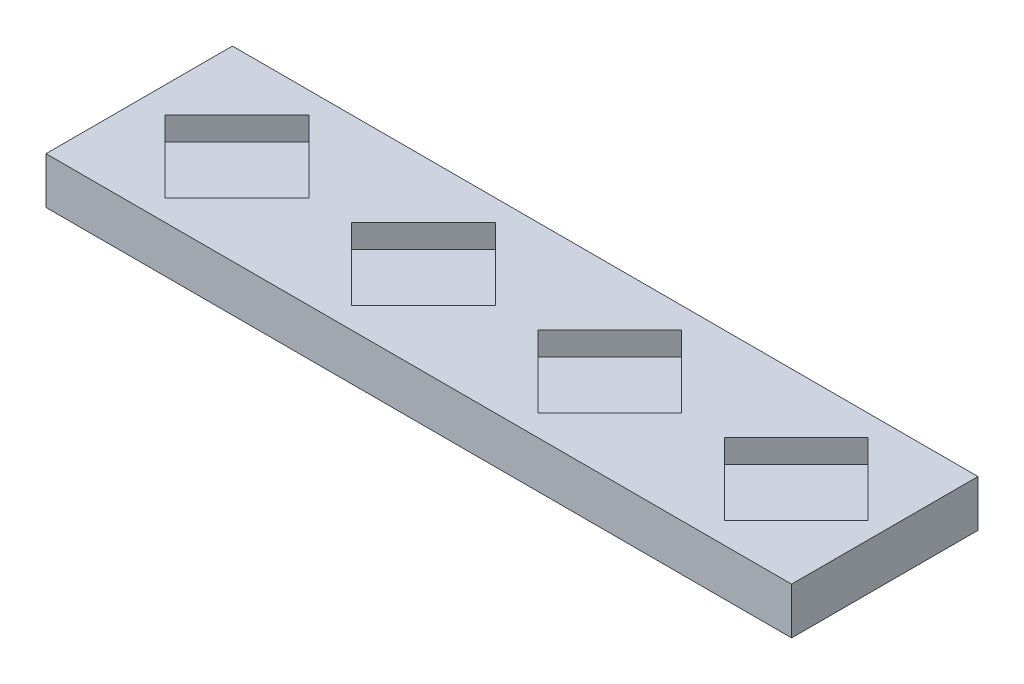
ISO-10303-21;
HEADER;
FILE_DESCRIPTION(('STEP AP214'),'2;1');
FILE_NAME('part.step','',(''),(''),'','','');
FILE_SCHEMA(('AUTOMOTIVE_DESIGN { 1 0 10303 214 1 1 1 1 }'));
ENDSEC;
DATA;
#1=APPLICATION_CONTEXT('core data for automotive mechanical design processes');
#2=APPLICATION_PROTOCOL_DEFINITION('international standard','automotive_design',2000,#1);
#3=PRODUCT_CONTEXT('',#1,'mechanical');
#4=PRODUCT('Part','Part','',(#3));
#5=PRODUCT_RELATED_PRODUCT_CATEGORY('part','',(#4));
#6=PRODUCT_DEFINITION_FORMATION('','',#4);
#7=PRODUCT_DEFINITION_CONTEXT('part definition',#1,'design');
#8=PRODUCT_DEFINITION('design','',#6,#7);
#9=PRODUCT_DEFINITION_SHAPE('','',#8);
#10=(LENGTH_UNIT() NAMED_UNIT(*) SI_UNIT(.MILLI.,.METRE.));
#11=(NAMED_UNIT(*) PLANE_ANGLE_UNIT() SI_UNIT($,.RADIAN.));
#12=(NAMED_UNIT(*) SI_UNIT($,.STERADIAN.) SOLID_ANGLE_UNIT());
#13=UNCERTAINTY_MEASURE_WITH_UNIT(LENGTH_MEASURE(1.E-05),#10,'distance_accuracy_value','');
#14=(GEOMETRIC_REPRESENTATION_CONTEXT(3) GLOBAL_UNCERTAINTY_ASSIGNED_CONTEXT((#13)) GLOBAL_UNIT_ASSIGNED_CONTEXT((#10,
#11,#12)) REPRESENTATION_CONTEXT('',''));
#15=CARTESIAN_POINT('',(0.,0.,0.));
#16=DIRECTION('',(0.,0.,1.));
#17=DIRECTION('',(1.,0.,0.));
#18=AXIS2_PLACEMENT_3D('',#15,#16,#17);
#19=CARTESIAN_POINT('',(0.,12.7,0.));
#20=DIRECTION('',(0.,0.,-1.));
#21=DIRECTION('',(-1.,0.,0.));
#22=AXIS2_PLACEMENT_3D('',#19,#20,#21);
#23=PLANE('',#22);
#24=DIRECTION('',(1.,0.,0.));
#25=VECTOR('',#24,1.);
#26=CARTESIAN_POINT('',(0.,0.,0.));
#27=LINE('',#26,#25);
#28=CARTESIAN_POINT('',(-203.2,0.,0.));
#29=VERTEX_POINT('',#28);
#30=CARTESIAN_POINT('',(0.,0.,0.));
#31=VERTEX_POINT('',#30);
#32=EDGE_CURVE('E224',#29,#31,#27,.T.);
#33=ORIENTED_EDGE('',*,*,#32,.T.);
#34=DIRECTION('',(0.,-1.,0.));
#35=VECTOR('',#34,1.);
#36=CARTESIAN_POINT('',(0.,12.7,0.));
#37=LINE('',#36,#35);
#38=CARTESIAN_POINT('',(0.,12.7,0.));
#39=VERTEX_POINT('',#38);
#40=EDGE_CURVE('E11',#39,#31,#37,.T.);
#41=ORIENTED_EDGE('',*,*,#40,.F.);
#42=DIRECTION('',(1.,0.,0.));
#43=VECTOR('',#42,1.);
#44=CARTESIAN_POINT('',(0.,12.7,0.));
#45=LINE('',#44,#43);
#46=CARTESIAN_POINT('',(-203.2,12.7,0.));
#47=VERTEX_POINT('',#46);
#48=EDGE_CURVE('E359',#47,#39,#45,.T.);
#49=ORIENTED_EDGE('',*,*,#48,.F.);
#50=DIRECTION('',(0.,-1.,0.));
#51=VECTOR('',#50,1.);
#52=CARTESIAN_POINT('',(-203.2,12.7,0.));
#53=LINE('',#52,#51);
#54=EDGE_CURVE('E373',#47,#29,#53,.T.);
#55=ORIENTED_EDGE('',*,*,#54,.T.);
#56=EDGE_LOOP('',(#33,#41,#49,#55));
#57=FACE_BOUND('',#56,.T.);
#58=ADVANCED_FACE('F41',(#57),#23,.F.);
#59=CARTESIAN_POINT('',(0.,12.7,-50.8));
#60=DIRECTION('',(-1.,0.,0.));
#61=DIRECTION('',(0.,0.,1.));
#62=AXIS2_PLACEMENT_3D('',#59,#60,#61);
#63=PLANE('',#62);
#64=DIRECTION('',(0.,0.,-1.));
#65=VECTOR('',#64,1.);
#66=CARTESIAN_POINT('',(0.,0.,-50.8));
#67=LINE('',#66,#65);
#68=CARTESIAN_POINT('',(0.,0.,-50.8));
#69=VERTEX_POINT('',#68);
#70=EDGE_CURVE('E377',#31,#69,#67,.T.);
#71=ORIENTED_EDGE('',*,*,#70,.T.);
#72=DIRECTION('',(0.,-1.,0.));
#73=VECTOR('',#72,1.);
#74=CARTESIAN_POINT('',(0.,12.7,-50.8));
#75=LINE('',#74,#73);
#76=CARTESIAN_POINT('',(0.,12.7,-50.8));
#77=VERTEX_POINT('',#76);
#78=EDGE_CURVE('E49',#77,#69,#75,.T.);
#79=ORIENTED_EDGE('',*,*,#78,.F.);
#80=DIRECTION('',(0.,0.,-1.));
#81=VECTOR('',#80,1.);
#82=CARTESIAN_POINT('',(0.,12.7,-50.8));
#83=LINE('',#82,#81);
#84=EDGE_CURVE('E363',#39,#77,#83,.T.);
#85=ORIENTED_EDGE('',*,*,#84,.F.);
#86=ORIENTED_EDGE('',*,*,#40,.T.);
#87=EDGE_LOOP('',(#71,#79,#85,#86));
#88=FACE_BOUND('',#87,.T.);
#89=ADVANCED_FACE('F413',(#88),#63,.F.);
#90=CARTESIAN_POINT('',(-203.2,12.7,-50.8));
#91=DIRECTION('',(0.,0.,1.));
#92=DIRECTION('',(1.,0.,0.));
#93=AXIS2_PLACEMENT_3D('',#90,#91,#92);
#94=PLANE('',#93);
#95=DIRECTION('',(-1.,0.,0.));
#96=VECTOR('',#95,1.);
#97=CARTESIAN_POINT('',(-203.2,0.,-50.8));
#98=LINE('',#97,#96);
#99=CARTESIAN_POINT('',(-203.2,0.,-50.8));
#100=VERTEX_POINT('',#99);
#101=EDGE_CURVE('E380',#69,#100,#98,.T.);
#102=ORIENTED_EDGE('',*,*,#101,.T.);
#103=DIRECTION('',(0.,-1.,0.));
#104=VECTOR('',#103,1.);
#105=CARTESIAN_POINT('',(-203.2,12.7,-50.8));
#106=LINE('',#105,#104);
#107=CARTESIAN_POINT('',(-203.2,12.7,-50.8));
#108=VERTEX_POINT('',#107);
#109=EDGE_CURVE('E388',#108,#100,#106,.T.);
#110=ORIENTED_EDGE('',*,*,#109,.F.);
#111=DIRECTION('',(-1.,0.,0.));
#112=VECTOR('',#111,1.);
#113=CARTESIAN_POINT('',(-203.2,12.7,-50.8));
#114=LINE('',#113,#112);
#115=EDGE_CURVE('E367',#77,#108,#114,.T.);
#116=ORIENTED_EDGE('',*,*,#115,.F.);
#117=ORIENTED_EDGE('',*,*,#78,.T.);
#118=EDGE_LOOP('',(#102,#110,#116,#117));
#119=FACE_BOUND('',#118,.T.);
#120=ADVANCED_FACE('F397',(#119),#94,.F.);
#121=CARTESIAN_POINT('',(-203.2,12.7,0.));
#122=DIRECTION('',(1.,0.,0.));
#123=DIRECTION('',(0.,0.,-1.));
#124=AXIS2_PLACEMENT_3D('',#121,#122,#123);
#125=PLANE('',#124);
#126=DIRECTION('',(0.,0.,1.));
#127=VECTOR('',#126,1.);
#128=CARTESIAN_POINT('',(-203.2,0.,0.));
#129=LINE('',#128,#127);
#130=EDGE_CURVE('E364',#100,#29,#129,.T.);
#131=ORIENTED_EDGE('',*,*,#130,.T.);
#132=ORIENTED_EDGE('',*,*,#54,.F.);
#133=DIRECTION('',(0.,0.,1.));
#134=VECTOR('',#133,1.);
#135=CARTESIAN_POINT('',(-203.2,12.7,0.));
#136=LINE('',#135,#134);
#137=EDGE_CURVE('E370',#108,#47,#136,.T.);
#138=ORIENTED_EDGE('',*,*,#137,.F.);
#139=ORIENTED_EDGE('',*,*,#109,.T.);
#140=EDGE_LOOP('',(#131,#132,#138,#139));
#141=FACE_BOUND('',#140,.T.);
#142=ADVANCED_FACE('F406',(#141),#125,.F.);
#143=CARTESIAN_POINT('',(0.,12.7,0.));
#144=DIRECTION('',(0.,-1.,0.));
#145=DIRECTION('',(0.,0.,-1.));
#146=AXIS2_PLACEMENT_3D('',#143,#144,#145);
#147=PLANE('',#146);
#148=DIRECTION('',(0.707106781186547,0.,-0.707106781186548));
#149=VECTOR('',#148,1.);
#150=CARTESIAN_POINT('',(-176.534655494317,12.7,-5.82520155385496));
#151=LINE('',#150,#149);
#152=CARTESIAN_POINT('',(-176.534655494317,12.7,-5.82520155385502));
#153=VERTEX_POINT('',#152);
#154=CARTESIAN_POINT('',(-156.959857048172,12.7,-25.4));
#155=VERTEX_POINT('',#154);
#156=EDGE_CURVE('E214',#153,#155,#151,.T.);
#157=ORIENTED_EDGE('',*,*,#156,.F.);
#158=DIRECTION('',(0.707106781186548,0.,0.707106781186548));
#159=VECTOR('',#158,1.);
#160=CARTESIAN_POINT('',(-196.109453940463,12.7,-25.4));
#161=LINE('',#160,#159);
#162=CARTESIAN_POINT('',(-196.109453940463,12.7,-25.4));
#163=VERTEX_POINT('',#162);
#164=EDGE_CURVE('E56',#163,#153,#161,.T.);
#165=ORIENTED_EDGE('',*,*,#164,.F.);
#166=DIRECTION('',(-0.707106781186548,0.,0.707106781186547));
#167=VECTOR('',#166,1.);
#168=CARTESIAN_POINT('',(-196.109453940463,12.7,-25.4));
#169=LINE('',#168,#167);
#170=CARTESIAN_POINT('',(-176.534655494317,12.7,-44.974798446145));
#171=VERTEX_POINT('',#170);
#172=EDGE_CURVE('E201',#171,#163,#169,.T.);
#173=ORIENTED_EDGE('',*,*,#172,.F.);
#174=DIRECTION('',(-0.707106781186547,0.,-0.707106781186548));
#175=VECTOR('',#174,1.);
#176=CARTESIAN_POINT('',(-176.534655494317,12.7,-44.974798446145));
#177=LINE('',#176,#175);
#178=EDGE_CURVE('E205',#155,#171,#177,.T.);
#179=ORIENTED_EDGE('',*,*,#178,.F.);
#180=EDGE_LOOP('',(#157,#165,#173,#179));
#181=FACE_BOUND('',#180,.T.);
#182=DIRECTION('',(0.707106781186547,0.,-0.707106781186548));
#183=VECTOR('',#182,1.);
#184=CARTESIAN_POINT('',(-125.734655494317,12.7,-5.82520155385496));
#185=LINE('',#184,#183);
#186=CARTESIAN_POINT('',(-125.734655494317,12.7,-5.82520155385497));
#187=VERTEX_POINT('',#186);
#188=CARTESIAN_POINT('',(-106.159857048172,12.7,-25.4));
#189=VERTEX_POINT('',#188);
#190=EDGE_CURVE('E250',#187,#189,#185,.T.);
#191=ORIENTED_EDGE('',*,*,#190,.F.);
#192=DIRECTION('',(0.707106781186548,0.,0.707106781186548));
#193=VECTOR('',#192,1.);
#194=CARTESIAN_POINT('',(-145.309453940463,12.7,-25.4));
#195=LINE('',#194,#193);
#196=CARTESIAN_POINT('',(-145.309453940463,12.7,-25.4));
#197=VERTEX_POINT('',#196);
#198=EDGE_CURVE('E64',#197,#187,#195,.T.);
#199=ORIENTED_EDGE('',*,*,#198,.F.);
#200=DIRECTION('',(-0.707106781186548,0.,0.707106781186547));
#201=VECTOR('',#200,1.);
#202=CARTESIAN_POINT('',(-145.309453940463,12.7,-25.4));
#203=LINE('',#202,#201);
#204=CARTESIAN_POINT('',(-125.734655494317,12.7,-44.974798446145));
#205=VERTEX_POINT('',#204);
#206=EDGE_CURVE('E235',#205,#197,#203,.T.);
#207=ORIENTED_EDGE('',*,*,#206,.F.);
#208=DIRECTION('',(-0.707106781186547,0.,-0.707106781186548));
#209=VECTOR('',#208,1.);
#210=CARTESIAN_POINT('',(-125.734655494317,12.7,-44.974798446145));
#211=LINE('',#210,#209);
#212=EDGE_CURVE('E255',#189,#205,#211,.T.);
#213=ORIENTED_EDGE('',*,*,#212,.F.);
#214=EDGE_LOOP('',(#191,#199,#207,#213));
#215=FACE_BOUND('',#214,.T.);
#216=DIRECTION('',(0.707106781186547,0.,-0.707106781186548));
#217=VECTOR('',#216,1.);
#218=CARTESIAN_POINT('',(-74.9346554943175,12.7,-5.82520155385496));
#219=LINE('',#218,#217);
#220=CARTESIAN_POINT('',(-74.9346554943175,12.7,-5.82520155385496));
#221=VERTEX_POINT('',#220);
#222=CARTESIAN_POINT('',(-55.3598570481725,12.7,-25.4));
#223=VERTEX_POINT('',#222);
#224=EDGE_CURVE('E293',#221,#223,#219,.T.);
#225=ORIENTED_EDGE('',*,*,#224,.F.);
#226=DIRECTION('',(0.707106781186548,0.,0.707106781186548));
#227=VECTOR('',#226,1.);
#228=CARTESIAN_POINT('',(-94.5094539404625,12.7,-25.4));
#229=LINE('',#228,#227);
#230=CARTESIAN_POINT('',(-94.5094539404625,12.7,-25.4));
#231=VERTEX_POINT('',#230);
#232=EDGE_CURVE('E290',#231,#221,#229,.T.);
#233=ORIENTED_EDGE('',*,*,#232,.F.);
#234=DIRECTION('',(-0.707106781186548,0.,0.707106781186547));
#235=VECTOR('',#234,1.);
#236=CARTESIAN_POINT('',(-94.5094539404625,12.7,-25.4));
#237=LINE('',#236,#235);
#238=CARTESIAN_POINT('',(-74.9346554943175,12.7,-44.974798446145));
#239=VERTEX_POINT('',#238);
#240=EDGE_CURVE('E277',#239,#231,#237,.T.);
#241=ORIENTED_EDGE('',*,*,#240,.F.);
#242=DIRECTION('',(-0.707106781186547,0.,-0.707106781186548));
#243=VECTOR('',#242,1.);
#244=CARTESIAN_POINT('',(-74.9346554943175,12.7,-44.974798446145));
#245=LINE('',#244,#243);
#246=EDGE_CURVE('E298',#223,#239,#245,.T.);
#247=ORIENTED_EDGE('',*,*,#246,.F.);
#248=EDGE_LOOP('',(#225,#233,#241,#247));
#249=FACE_BOUND('',#248,.T.);
#250=DIRECTION('',(0.707106781186547,0.,-0.707106781186548));
#251=VECTOR('',#250,1.);
#252=CARTESIAN_POINT('',(-24.1346554943175,12.7,-5.82520155385496));
#253=LINE('',#252,#251);
#254=CARTESIAN_POINT('',(-24.1346554943175,12.7,-5.82520155385496));
#255=VERTEX_POINT('',#254);
#256=CARTESIAN_POINT('',(-4.55985704817247,12.7,-25.4));
#257=VERTEX_POINT('',#256);
#258=EDGE_CURVE('E337',#255,#257,#253,.T.);
#259=ORIENTED_EDGE('',*,*,#258,.F.);
#260=DIRECTION('',(0.707106781186548,0.,0.707106781186548));
#261=VECTOR('',#260,1.);
#262=CARTESIAN_POINT('',(-43.7094539404625,12.7,-25.4));
#263=LINE('',#262,#261);
#264=CARTESIAN_POINT('',(-43.7094539404625,12.7,-25.4));
#265=VERTEX_POINT('',#264);
#266=EDGE_CURVE('E334',#265,#255,#263,.T.);
#267=ORIENTED_EDGE('',*,*,#266,.F.);
#268=DIRECTION('',(-0.707106781186548,0.,0.707106781186547));
#269=VECTOR('',#268,1.);
#270=CARTESIAN_POINT('',(-43.7094539404625,12.7,-25.4));
#271=LINE('',#270,#269);
#272=CARTESIAN_POINT('',(-24.1346554943175,12.7,-44.974798446145));
#273=VERTEX_POINT('',#272);
#274=EDGE_CURVE('E321',#273,#265,#271,.T.);
#275=ORIENTED_EDGE('',*,*,#274,.F.);
#276=DIRECTION('',(-0.707106781186547,0.,-0.707106781186548));
#277=VECTOR('',#276,1.);
#278=CARTESIAN_POINT('',(-24.1346554943175,12.7,-44.974798446145));
#279=LINE('',#278,#277);
#280=EDGE_CURVE('E341',#257,#273,#279,.T.);
#281=ORIENTED_EDGE('',*,*,#280,.F.);
#282=EDGE_LOOP('',(#259,#267,#275,#281));
#283=FACE_BOUND('',#282,.T.);
#284=ORIENTED_EDGE('',*,*,#48,.T.);
#285=ORIENTED_EDGE('',*,*,#84,.T.);
#286=ORIENTED_EDGE('',*,*,#115,.T.);
#287=ORIENTED_EDGE('',*,*,#137,.T.);
#288=EDGE_LOOP('',(#284,#285,#286,#287));
#289=FACE_BOUND('',#288,.T.);
#290=ADVANCED_FACE('F412',(#181,#215,#249,#283,#289),#147,.F.);
#291=CARTESIAN_POINT('',(0.,0.,0.));
#292=DIRECTION('',(0.,-1.,0.));
#293=DIRECTION('',(0.,0.,-1.));
#294=AXIS2_PLACEMENT_3D('',#291,#292,#293);
#295=PLANE('',#294);
#296=ORIENTED_EDGE('',*,*,#32,.F.);
#297=ORIENTED_EDGE('',*,*,#130,.F.);
#298=ORIENTED_EDGE('',*,*,#101,.F.);
#299=ORIENTED_EDGE('',*,*,#70,.F.);
#300=EDGE_LOOP('',(#296,#297,#298,#299));
#301=FACE_BOUND('',#300,.T.);
#302=ADVANCED_FACE('F403',(#301),#295,.T.);
#303=CARTESIAN_POINT('',(-43.7094539404625,6.35,-25.4));
#304=DIRECTION('',(-0.707106781186548,0.,0.707106781186548));
#305=DIRECTION('',(0.707106781186548,0.,0.707106781186548));
#306=AXIS2_PLACEMENT_3D('',#303,#304,#305);
#307=PLANE('',#306);
#308=ORIENTED_EDGE('',*,*,#266,.T.);
#309=DIRECTION('',(0.,1.,0.));
#310=VECTOR('',#309,1.);
#311=CARTESIAN_POINT('',(-24.1346554943175,6.35,-5.82520155385496));
#312=LINE('',#311,#310);
#313=CARTESIAN_POINT('',(-24.1346554943175,6.35,-5.82520155385496));
#314=VERTEX_POINT('',#313);
#315=EDGE_CURVE('E333',#314,#255,#312,.T.);
#316=ORIENTED_EDGE('',*,*,#315,.F.);
#317=DIRECTION('',(0.707106781186548,0.,0.707106781186548));
#318=VECTOR('',#317,1.);
#319=CARTESIAN_POINT('',(-43.7094539404625,6.35,-25.4));
#320=LINE('',#319,#318);
#321=CARTESIAN_POINT('',(-43.7094539404625,6.35,-25.4));
#322=VERTEX_POINT('',#321);
#323=EDGE_CURVE('E316',#322,#314,#320,.T.);
#324=ORIENTED_EDGE('',*,*,#323,.F.);
#325=DIRECTION('',(0.,1.,0.));
#326=VECTOR('',#325,1.);
#327=CARTESIAN_POINT('',(-43.7094539404625,6.35,-25.4));
#328=LINE('',#327,#326);
#329=EDGE_CURVE('E294',#322,#265,#328,.T.);
#330=ORIENTED_EDGE('',*,*,#329,.T.);
#331=EDGE_LOOP('',(#308,#316,#324,#330));
#332=FACE_BOUND('',#331,.T.);
#333=ADVANCED_FACE('F425',(#332),#307,.F.);
#334=CARTESIAN_POINT('',(-43.7094539404625,6.35,-25.4));
#335=DIRECTION('',(-0.707106781186547,0.,-0.707106781186548));
#336=DIRECTION('',(-0.707106781186548,0.,0.707106781186547));
#337=AXIS2_PLACEMENT_3D('',#334,#335,#336);
#338=PLANE('',#337);
#339=ORIENTED_EDGE('',*,*,#274,.T.);
#340=ORIENTED_EDGE('',*,*,#329,.F.);
#341=DIRECTION('',(-0.707106781186548,0.,0.707106781186547));
#342=VECTOR('',#341,1.);
#343=CARTESIAN_POINT('',(-43.7094539404625,6.35,-25.4));
#344=LINE('',#343,#342);
#345=CARTESIAN_POINT('',(-24.1346554943175,6.35,-44.974798446145));
#346=VERTEX_POINT('',#345);
#347=EDGE_CURVE('E329',#346,#322,#344,.T.);
#348=ORIENTED_EDGE('',*,*,#347,.F.);
#349=DIRECTION('',(0.,1.,0.));
#350=VECTOR('',#349,1.);
#351=CARTESIAN_POINT('',(-24.1346554943175,6.35,-44.974798446145));
#352=LINE('',#351,#350);
#353=EDGE_CURVE('E350',#346,#273,#352,.T.);
#354=ORIENTED_EDGE('',*,*,#353,.T.);
#355=EDGE_LOOP('',(#339,#340,#348,#354));
#356=FACE_BOUND('',#355,.T.);
#357=ADVANCED_FACE('F431',(#356),#338,.F.);
#358=CARTESIAN_POINT('',(-24.1346554943175,6.35,-44.974798446145));
#359=DIRECTION('',(0.707106781186548,0.,-0.707106781186547));
#360=DIRECTION('',(-0.707106781186547,0.,-0.707106781186548));
#361=AXIS2_PLACEMENT_3D('',#358,#359,#360);
#362=PLANE('',#361);
#363=ORIENTED_EDGE('',*,*,#280,.T.);
#364=ORIENTED_EDGE('',*,*,#353,.F.);
#365=DIRECTION('',(-0.707106781186547,0.,-0.707106781186548));
#366=VECTOR('',#365,1.);
#367=CARTESIAN_POINT('',(-24.1346554943175,6.35,-44.974798446145));
#368=LINE('',#367,#366);
#369=CARTESIAN_POINT('',(-4.55985704817247,6.35,-25.4));
#370=VERTEX_POINT('',#369);
#371=EDGE_CURVE('E325',#370,#346,#368,.T.);
#372=ORIENTED_EDGE('',*,*,#371,.F.);
#373=DIRECTION('',(0.,1.,0.));
#374=VECTOR('',#373,1.);
#375=CARTESIAN_POINT('',(-4.55985704817247,6.35,-25.4));
#376=LINE('',#375,#374);
#377=EDGE_CURVE('E353',#370,#257,#376,.T.);
#378=ORIENTED_EDGE('',*,*,#377,.T.);
#379=EDGE_LOOP('',(#363,#364,#372,#378));
#380=FACE_BOUND('',#379,.T.);
#381=ADVANCED_FACE('F437',(#380),#362,.F.);
#382=CARTESIAN_POINT('',(-24.1346554943175,6.35,-5.82520155385496));
#383=DIRECTION('',(0.707106781186548,0.,0.707106781186547));
#384=DIRECTION('',(0.707106781186547,0.,-0.707106781186548));
#385=AXIS2_PLACEMENT_3D('',#382,#383,#384);
#386=PLANE('',#385);
#387=ORIENTED_EDGE('',*,*,#258,.T.);
#388=ORIENTED_EDGE('',*,*,#377,.F.);
#389=DIRECTION('',(0.707106781186547,0.,-0.707106781186548));
#390=VECTOR('',#389,1.);
#391=CARTESIAN_POINT('',(-24.1346554943175,6.35,-5.82520155385496));
#392=LINE('',#391,#390);
#393=EDGE_CURVE('E320',#314,#370,#392,.T.);
#394=ORIENTED_EDGE('',*,*,#393,.F.);
#395=ORIENTED_EDGE('',*,*,#315,.T.);
#396=EDGE_LOOP('',(#387,#388,#394,#395));
#397=FACE_BOUND('',#396,.T.);
#398=ADVANCED_FACE('F433',(#397),#386,.F.);
#399=CARTESIAN_POINT('',(0.,6.35,0.));
#400=DIRECTION('',(0.,1.,0.));
#401=DIRECTION('',(0.,0.,1.));
#402=AXIS2_PLACEMENT_3D('',#399,#400,#401);
#403=PLANE('',#402);
#404=ORIENTED_EDGE('',*,*,#323,.T.);
#405=ORIENTED_EDGE('',*,*,#393,.T.);
#406=ORIENTED_EDGE('',*,*,#371,.T.);
#407=ORIENTED_EDGE('',*,*,#347,.T.);
#408=EDGE_LOOP('',(#404,#405,#406,#407));
#409=FACE_BOUND('',#408,.T.);
#410=ADVANCED_FACE('F436',(#409),#403,.T.);
#411=CARTESIAN_POINT('',(-94.5094539404625,6.35,-25.4));
#412=DIRECTION('',(-0.707106781186548,0.,0.707106781186548));
#413=DIRECTION('',(0.707106781186548,0.,0.707106781186548));
#414=AXIS2_PLACEMENT_3D('',#411,#412,#413);
#415=PLANE('',#414);
#416=ORIENTED_EDGE('',*,*,#232,.T.);
#417=DIRECTION('',(0.,1.,0.));
#418=VECTOR('',#417,1.);
#419=CARTESIAN_POINT('',(-74.9346554943175,6.35,-5.82520155385496));
#420=LINE('',#419,#418);
#421=CARTESIAN_POINT('',(-74.9346554943175,6.35,-5.82520155385496));
#422=VERTEX_POINT('',#421);
#423=EDGE_CURVE('E289',#422,#221,#420,.T.);
#424=ORIENTED_EDGE('',*,*,#423,.F.);
#425=DIRECTION('',(0.707106781186548,0.,0.707106781186548));
#426=VECTOR('',#425,1.);
#427=CARTESIAN_POINT('',(-94.5094539404625,6.35,-25.4));
#428=LINE('',#427,#426);
#429=CARTESIAN_POINT('',(-94.5094539404625,6.35,-25.4));
#430=VERTEX_POINT('',#429);
#431=EDGE_CURVE('E272',#430,#422,#428,.T.);
#432=ORIENTED_EDGE('',*,*,#431,.F.);
#433=DIRECTION('',(0.,1.,0.));
#434=VECTOR('',#433,1.);
#435=CARTESIAN_POINT('',(-94.5094539404625,6.35,-25.4));
#436=LINE('',#435,#434);
#437=EDGE_CURVE('E251',#430,#231,#436,.T.);
#438=ORIENTED_EDGE('',*,*,#437,.T.);
#439=EDGE_LOOP('',(#416,#424,#432,#438));
#440=FACE_BOUND('',#439,.T.);
#441=ADVANCED_FACE('F447',(#440),#415,.F.);
#442=CARTESIAN_POINT('',(-94.5094539404625,6.35,-25.4));
#443=DIRECTION('',(-0.707106781186547,0.,-0.707106781186548));
#444=DIRECTION('',(-0.707106781186548,0.,0.707106781186547));
#445=AXIS2_PLACEMENT_3D('',#442,#443,#444);
#446=PLANE('',#445);
#447=ORIENTED_EDGE('',*,*,#240,.T.);
#448=ORIENTED_EDGE('',*,*,#437,.F.);
#449=DIRECTION('',(-0.707106781186548,0.,0.707106781186547));
#450=VECTOR('',#449,1.);
#451=CARTESIAN_POINT('',(-94.5094539404625,6.35,-25.4));
#452=LINE('',#451,#450);
#453=CARTESIAN_POINT('',(-74.9346554943175,6.35,-44.974798446145));
#454=VERTEX_POINT('',#453);
#455=EDGE_CURVE('E285',#454,#430,#452,.T.);
#456=ORIENTED_EDGE('',*,*,#455,.F.);
#457=DIRECTION('',(0.,1.,0.));
#458=VECTOR('',#457,1.);
#459=CARTESIAN_POINT('',(-74.9346554943175,6.35,-44.974798446145));
#460=LINE('',#459,#458);
#461=EDGE_CURVE('E307',#454,#239,#460,.T.);
#462=ORIENTED_EDGE('',*,*,#461,.T.);
#463=EDGE_LOOP('',(#447,#448,#456,#462));
#464=FACE_BOUND('',#463,.T.);
#465=ADVANCED_FACE('F451',(#464),#446,.F.);
#466=CARTESIAN_POINT('',(-74.9346554943175,6.35,-44.974798446145));
#467=DIRECTION('',(0.707106781186548,0.,-0.707106781186547));
#468=DIRECTION('',(-0.707106781186547,0.,-0.707106781186548));
#469=AXIS2_PLACEMENT_3D('',#466,#467,#468);
#470=PLANE('',#469);
#471=ORIENTED_EDGE('',*,*,#246,.T.);
#472=ORIENTED_EDGE('',*,*,#461,.F.);
#473=DIRECTION('',(-0.707106781186547,0.,-0.707106781186548));
#474=VECTOR('',#473,1.);
#475=CARTESIAN_POINT('',(-74.9346554943175,6.35,-44.974798446145));
#476=LINE('',#475,#474);
#477=CARTESIAN_POINT('',(-55.3598570481725,6.35,-25.4));
#478=VERTEX_POINT('',#477);
#479=EDGE_CURVE('E281',#478,#454,#476,.T.);
#480=ORIENTED_EDGE('',*,*,#479,.F.);
#481=DIRECTION('',(0.,1.,0.));
#482=VECTOR('',#481,1.);
#483=CARTESIAN_POINT('',(-55.3598570481725,6.35,-25.4));
#484=LINE('',#483,#482);
#485=EDGE_CURVE('E310',#478,#223,#484,.T.);
#486=ORIENTED_EDGE('',*,*,#485,.T.);
#487=EDGE_LOOP('',(#471,#472,#480,#486));
#488=FACE_BOUND('',#487,.T.);
#489=ADVANCED_FACE('F457',(#488),#470,.F.);
#490=CARTESIAN_POINT('',(-74.9346554943175,6.35,-5.82520155385496));
#491=DIRECTION('',(0.707106781186548,0.,0.707106781186547));
#492=DIRECTION('',(0.707106781186547,0.,-0.707106781186548));
#493=AXIS2_PLACEMENT_3D('',#490,#491,#492);
#494=PLANE('',#493);
#495=ORIENTED_EDGE('',*,*,#224,.T.);
#496=ORIENTED_EDGE('',*,*,#485,.F.);
#497=DIRECTION('',(0.707106781186547,0.,-0.707106781186548));
#498=VECTOR('',#497,1.);
#499=CARTESIAN_POINT('',(-74.9346554943175,6.35,-5.82520155385496));
#500=LINE('',#499,#498);
#501=EDGE_CURVE('E276',#422,#478,#500,.T.);
#502=ORIENTED_EDGE('',*,*,#501,.F.);
#503=ORIENTED_EDGE('',*,*,#423,.T.);
#504=EDGE_LOOP('',(#495,#496,#502,#503));
#505=FACE_BOUND('',#504,.T.);
#506=ADVANCED_FACE('F453',(#505),#494,.F.);
#507=CARTESIAN_POINT('',(0.,6.35,0.));
#508=DIRECTION('',(0.,1.,0.));
#509=DIRECTION('',(0.,0.,1.));
#510=AXIS2_PLACEMENT_3D('',#507,#508,#509);
#511=PLANE('',#510);
#512=ORIENTED_EDGE('',*,*,#431,.T.);
#513=ORIENTED_EDGE('',*,*,#501,.T.);
#514=ORIENTED_EDGE('',*,*,#479,.T.);
#515=ORIENTED_EDGE('',*,*,#455,.T.);
#516=EDGE_LOOP('',(#512,#513,#514,#515));
#517=FACE_BOUND('',#516,.T.);
#518=ADVANCED_FACE('F456',(#517),#511,.T.);
#519=CARTESIAN_POINT('',(-145.309453940463,6.35,-25.4));
#520=DIRECTION('',(-0.707106781186548,0.,0.707106781186548));
#521=DIRECTION('',(0.707106781186548,0.,0.707106781186548));
#522=AXIS2_PLACEMENT_3D('',#519,#520,#521);
#523=PLANE('',#522);
#524=ORIENTED_EDGE('',*,*,#198,.T.);
#525=DIRECTION('',(0.,1.,0.));
#526=VECTOR('',#525,1.);
#527=CARTESIAN_POINT('',(-125.734655494317,6.35,-5.82520155385496));
#528=LINE('',#527,#526);
#529=CARTESIAN_POINT('',(-125.734655494317,6.35,-5.82520155385496));
#530=VERTEX_POINT('',#529);
#531=EDGE_CURVE('E247',#530,#187,#528,.T.);
#532=ORIENTED_EDGE('',*,*,#531,.F.);
#533=DIRECTION('',(0.707106781186548,0.,0.707106781186548));
#534=VECTOR('',#533,1.);
#535=CARTESIAN_POINT('',(-145.309453940463,6.35,-25.4));
#536=LINE('',#535,#534);
#537=CARTESIAN_POINT('',(-145.309453940463,6.35,-25.4));
#538=VERTEX_POINT('',#537);
#539=EDGE_CURVE('E230',#538,#530,#536,.T.);
#540=ORIENTED_EDGE('',*,*,#539,.F.);
#541=DIRECTION('',(0.,1.,0.));
#542=VECTOR('',#541,1.);
#543=CARTESIAN_POINT('',(-145.309453940463,6.35,-25.4));
#544=LINE('',#543,#542);
#545=EDGE_CURVE('E215',#538,#197,#544,.T.);
#546=ORIENTED_EDGE('',*,*,#545,.T.);
#547=EDGE_LOOP('',(#524,#532,#540,#546));
#548=FACE_BOUND('',#547,.T.);
#549=ADVANCED_FACE('F467',(#548),#523,.F.);
#550=CARTESIAN_POINT('',(-145.309453940463,6.35,-25.4));
#551=DIRECTION('',(-0.707106781186547,0.,-0.707106781186548));
#552=DIRECTION('',(-0.707106781186548,0.,0.707106781186547));
#553=AXIS2_PLACEMENT_3D('',#550,#551,#552);
#554=PLANE('',#553);
#555=ORIENTED_EDGE('',*,*,#206,.T.);
#556=ORIENTED_EDGE('',*,*,#545,.F.);
#557=DIRECTION('',(-0.707106781186548,0.,0.707106781186547));
#558=VECTOR('',#557,1.);
#559=CARTESIAN_POINT('',(-145.309453940463,6.35,-25.4));
#560=LINE('',#559,#558);
#561=CARTESIAN_POINT('',(-125.734655494317,6.35,-44.974798446145));
#562=VERTEX_POINT('',#561);
#563=EDGE_CURVE('E243',#562,#538,#560,.T.);
#564=ORIENTED_EDGE('',*,*,#563,.F.);
#565=DIRECTION('',(0.,1.,0.));
#566=VECTOR('',#565,1.);
#567=CARTESIAN_POINT('',(-125.734655494317,6.35,-44.974798446145));
#568=LINE('',#567,#566);
#569=EDGE_CURVE('E264',#562,#205,#568,.T.);
#570=ORIENTED_EDGE('',*,*,#569,.T.);
#571=EDGE_LOOP('',(#555,#556,#564,#570));
#572=FACE_BOUND('',#571,.T.);
#573=ADVANCED_FACE('F471',(#572),#554,.F.);
#574=CARTESIAN_POINT('',(-125.734655494317,6.35,-44.974798446145));
#575=DIRECTION('',(0.707106781186548,0.,-0.707106781186547));
#576=DIRECTION('',(-0.707106781186547,0.,-0.707106781186548));
#577=AXIS2_PLACEMENT_3D('',#574,#575,#576);
#578=PLANE('',#577);
#579=ORIENTED_EDGE('',*,*,#212,.T.);
#580=ORIENTED_EDGE('',*,*,#569,.F.);
#581=DIRECTION('',(-0.707106781186547,0.,-0.707106781186548));
#582=VECTOR('',#581,1.);
#583=CARTESIAN_POINT('',(-125.734655494317,6.35,-44.974798446145));
#584=LINE('',#583,#582);
#585=CARTESIAN_POINT('',(-106.159857048172,6.35,-25.4));
#586=VERTEX_POINT('',#585);
#587=EDGE_CURVE('E239',#586,#562,#584,.T.);
#588=ORIENTED_EDGE('',*,*,#587,.F.);
#589=DIRECTION('',(0.,1.,0.));
#590=VECTOR('',#589,1.);
#591=CARTESIAN_POINT('',(-106.159857048172,6.35,-25.4));
#592=LINE('',#591,#590);
#593=EDGE_CURVE('E267',#586,#189,#592,.T.);
#594=ORIENTED_EDGE('',*,*,#593,.T.);
#595=EDGE_LOOP('',(#579,#580,#588,#594));
#596=FACE_BOUND('',#595,.T.);
#597=ADVANCED_FACE('F476',(#596),#578,.F.);
#598=CARTESIAN_POINT('',(-125.734655494317,6.35,-5.82520155385496));
#599=DIRECTION('',(0.707106781186548,0.,0.707106781186547));
#600=DIRECTION('',(0.707106781186547,0.,-0.707106781186548));
#601=AXIS2_PLACEMENT_3D('',#598,#599,#600);
#602=PLANE('',#601);
#603=ORIENTED_EDGE('',*,*,#190,.T.);
#604=ORIENTED_EDGE('',*,*,#593,.F.);
#605=DIRECTION('',(0.707106781186547,0.,-0.707106781186548));
#606=VECTOR('',#605,1.);
#607=CARTESIAN_POINT('',(-125.734655494317,6.35,-5.82520155385496));
#608=LINE('',#607,#606);
#609=EDGE_CURVE('E234',#530,#586,#608,.T.);
#610=ORIENTED_EDGE('',*,*,#609,.F.);
#611=ORIENTED_EDGE('',*,*,#531,.T.);
#612=EDGE_LOOP('',(#603,#604,#610,#611));
#613=FACE_BOUND('',#612,.T.);
#614=ADVANCED_FACE('F472',(#613),#602,.F.);
#615=CARTESIAN_POINT('',(0.,6.35,0.));
#616=DIRECTION('',(0.,1.,0.));
#617=DIRECTION('',(0.,0.,1.));
#618=AXIS2_PLACEMENT_3D('',#615,#616,#617);
#619=PLANE('',#618);
#620=ORIENTED_EDGE('',*,*,#539,.T.);
#621=ORIENTED_EDGE('',*,*,#609,.T.);
#622=ORIENTED_EDGE('',*,*,#587,.T.);
#623=ORIENTED_EDGE('',*,*,#563,.T.);
#624=EDGE_LOOP('',(#620,#621,#622,#623));
#625=FACE_BOUND('',#624,.T.);
#626=ADVANCED_FACE('F475',(#625),#619,.T.);
#627=CARTESIAN_POINT('',(-196.109453940463,6.35,-25.4));
#628=DIRECTION('',(-0.707106781186548,0.,0.707106781186548));
#629=DIRECTION('',(0.707106781186548,0.,0.707106781186548));
#630=AXIS2_PLACEMENT_3D('',#627,#628,#629);
#631=PLANE('',#630);
#632=ORIENTED_EDGE('',*,*,#164,.T.);
#633=DIRECTION('',(0.,1.,0.));
#634=VECTOR('',#633,1.);
#635=CARTESIAN_POINT('',(-176.534655494317,6.35,-5.82520155385496));
#636=LINE('',#635,#634);
#637=CARTESIAN_POINT('',(-176.534655494317,6.35,-5.82520155385496));
#638=VERTEX_POINT('',#637);
#639=EDGE_CURVE('E176',#638,#153,#636,.T.);
#640=ORIENTED_EDGE('',*,*,#639,.F.);
#641=DIRECTION('',(0.707106781186548,0.,0.707106781186548));
#642=VECTOR('',#641,1.);
#643=CARTESIAN_POINT('',(-196.109453940463,6.35,-25.4));
#644=LINE('',#643,#642);
#645=CARTESIAN_POINT('',(-196.109453940463,6.35,-25.4));
#646=VERTEX_POINT('',#645);
#647=EDGE_CURVE('E180',#646,#638,#644,.T.);
#648=ORIENTED_EDGE('',*,*,#647,.F.);
#649=DIRECTION('',(0.,1.,0.));
#650=VECTOR('',#649,1.);
#651=CARTESIAN_POINT('',(-196.109453940463,6.35,-25.4));
#652=LINE('',#651,#650);
#653=EDGE_CURVE('E221',#646,#163,#652,.T.);
#654=ORIENTED_EDGE('',*,*,#653,.T.);
#655=EDGE_LOOP('',(#632,#640,#648,#654));
#656=FACE_BOUND('',#655,.T.);
#657=ADVANCED_FACE('F178',(#656),#631,.F.);
#658=CARTESIAN_POINT('',(-196.109453940463,6.35,-25.4));
#659=DIRECTION('',(-0.707106781186547,0.,-0.707106781186548));
#660=DIRECTION('',(-0.707106781186548,0.,0.707106781186547));
#661=AXIS2_PLACEMENT_3D('',#658,#659,#660);
#662=PLANE('',#661);
#663=ORIENTED_EDGE('',*,*,#172,.T.);
#664=ORIENTED_EDGE('',*,*,#653,.F.);
#665=DIRECTION('',(-0.707106781186548,0.,0.707106781186547));
#666=VECTOR('',#665,1.);
#667=CARTESIAN_POINT('',(-196.109453940463,6.35,-25.4));
#668=LINE('',#667,#666);
#669=CARTESIAN_POINT('',(-176.534655494317,6.35,-44.974798446145));
#670=VERTEX_POINT('',#669);
#671=EDGE_CURVE('E187',#670,#646,#668,.T.);
#672=ORIENTED_EDGE('',*,*,#671,.F.);
#673=DIRECTION('',(0.,1.,0.));
#674=VECTOR('',#673,1.);
#675=CARTESIAN_POINT('',(-176.534655494317,6.35,-44.974798446145));
#676=LINE('',#675,#674);
#677=EDGE_CURVE('E225',#670,#171,#676,.T.);
#678=ORIENTED_EDGE('',*,*,#677,.T.);
#679=EDGE_LOOP('',(#663,#664,#672,#678));
#680=FACE_BOUND('',#679,.T.);
#681=ADVANCED_FACE('F489',(#680),#662,.F.);
#682=CARTESIAN_POINT('',(-176.534655494317,6.35,-44.974798446145));
#683=DIRECTION('',(0.707106781186548,0.,-0.707106781186547));
#684=DIRECTION('',(-0.707106781186547,0.,-0.707106781186548));
#685=AXIS2_PLACEMENT_3D('',#682,#683,#684);
#686=PLANE('',#685);
#687=ORIENTED_EDGE('',*,*,#178,.T.);
#688=ORIENTED_EDGE('',*,*,#677,.F.);
#689=DIRECTION('',(-0.707106781186547,0.,-0.707106781186548));
#690=VECTOR('',#689,1.);
#691=CARTESIAN_POINT('',(-176.534655494317,6.35,-44.974798446145));
#692=LINE('',#691,#690);
#693=CARTESIAN_POINT('',(-156.959857048172,6.35,-25.4));
#694=VERTEX_POINT('',#693);
#695=EDGE_CURVE('E196',#694,#670,#692,.T.);
#696=ORIENTED_EDGE('',*,*,#695,.F.);
#697=DIRECTION('',(0.,1.,0.));
#698=VECTOR('',#697,1.);
#699=CARTESIAN_POINT('',(-156.959857048172,6.35,-25.4));
#700=LINE('',#699,#698);
#701=EDGE_CURVE('E186',#694,#155,#700,.T.);
#702=ORIENTED_EDGE('',*,*,#701,.T.);
#703=EDGE_LOOP('',(#687,#688,#696,#702));
#704=FACE_BOUND('',#703,.T.);
#705=ADVANCED_FACE('F492',(#704),#686,.F.);
#706=CARTESIAN_POINT('',(-176.534655494317,6.35,-5.82520155385496));
#707=DIRECTION('',(0.707106781186548,0.,0.707106781186547));
#708=DIRECTION('',(0.707106781186547,0.,-0.707106781186548));
#709=AXIS2_PLACEMENT_3D('',#706,#707,#708);
#710=PLANE('',#709);
#711=ORIENTED_EDGE('',*,*,#156,.T.);
#712=ORIENTED_EDGE('',*,*,#701,.F.);
#713=DIRECTION('',(0.707106781186547,0.,-0.707106781186548));
#714=VECTOR('',#713,1.);
#715=CARTESIAN_POINT('',(-176.534655494317,6.35,-5.82520155385496));
#716=LINE('',#715,#714);
#717=EDGE_CURVE('E190',#638,#694,#716,.T.);
#718=ORIENTED_EDGE('',*,*,#717,.F.);
#719=ORIENTED_EDGE('',*,*,#639,.T.);
#720=EDGE_LOOP('',(#711,#712,#718,#719));
#721=FACE_BOUND('',#720,.T.);
#722=ADVANCED_FACE('F191',(#721),#710,.F.);
#723=CARTESIAN_POINT('',(0.,6.35,0.));
#724=DIRECTION('',(0.,1.,0.));
#725=DIRECTION('',(0.,0.,1.));
#726=AXIS2_PLACEMENT_3D('',#723,#724,#725);
#727=PLANE('',#726);
#728=ORIENTED_EDGE('',*,*,#647,.T.);
#729=ORIENTED_EDGE('',*,*,#717,.T.);
#730=ORIENTED_EDGE('',*,*,#695,.T.);
#731=ORIENTED_EDGE('',*,*,#671,.T.);
#732=EDGE_LOOP('',(#728,#729,#730,#731));
#733=FACE_BOUND('',#732,.T.);
#734=ADVANCED_FACE('F198',(#733),#727,.T.);
#735=CLOSED_SHELL('',(#58,#89,#120,#142,#290,#302,#333,#357,#381,#398,#410,#441,#465,#489,#506,
#518,#549,#573,#597,#614,#626,#657,#681,#705,#722,#734));
#736=MANIFOLD_SOLID_BREP('B2',#735);
#737=ADVANCED_BREP_SHAPE_REPRESENTATION('',(#18,#736),#14);
#738=SHAPE_DEFINITION_REPRESENTATION(#9,#737);
ENDSEC;
END-ISO-10303-21;
